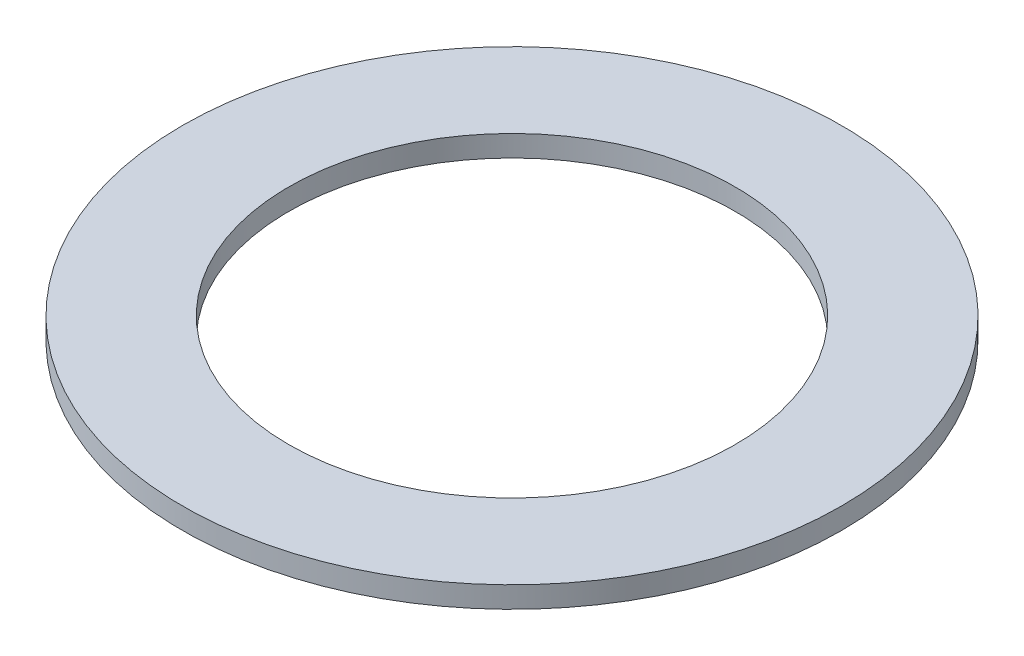
ISO-10303-21;
HEADER;
FILE_DESCRIPTION(('STEP AP214'),'2;1');
FILE_NAME('part.step','',(''),(''),'','','');
FILE_SCHEMA(('AUTOMOTIVE_DESIGN { 1 0 10303 214 1 1 1 1 }'));
ENDSEC;
DATA;
#1=APPLICATION_CONTEXT('core data for automotive mechanical design processes');
#2=APPLICATION_PROTOCOL_DEFINITION('international standard','automotive_design',2000,#1);
#3=PRODUCT_CONTEXT('',#1,'mechanical');
#4=PRODUCT('Part','Part','',(#3));
#5=PRODUCT_RELATED_PRODUCT_CATEGORY('part','',(#4));
#6=PRODUCT_DEFINITION_FORMATION('','',#4);
#7=PRODUCT_DEFINITION_CONTEXT('part definition',#1,'design');
#8=PRODUCT_DEFINITION('design','',#6,#7);
#9=PRODUCT_DEFINITION_SHAPE('','',#8);
#10=(LENGTH_UNIT() NAMED_UNIT(*) SI_UNIT(.MILLI.,.METRE.));
#11=(NAMED_UNIT(*) PLANE_ANGLE_UNIT() SI_UNIT($,.RADIAN.));
#12=(NAMED_UNIT(*) SI_UNIT($,.STERADIAN.) SOLID_ANGLE_UNIT());
#13=UNCERTAINTY_MEASURE_WITH_UNIT(LENGTH_MEASURE(1.E-05),#10,'distance_accuracy_value','');
#14=(GEOMETRIC_REPRESENTATION_CONTEXT(3) GLOBAL_UNCERTAINTY_ASSIGNED_CONTEXT((#13)) GLOBAL_UNIT_ASSIGNED_CONTEXT((#10,
#11,#12)) REPRESENTATION_CONTEXT('',''));
#15=CARTESIAN_POINT('',(0.,0.,0.));
#16=DIRECTION('',(0.,0.,1.));
#17=DIRECTION('',(1.,0.,0.));
#18=AXIS2_PLACEMENT_3D('',#15,#16,#17);
#19=CARTESIAN_POINT('',(0.,1.,0.));
#20=DIRECTION('',(0.,1.,0.));
#21=DIRECTION('',(0.,0.,1.));
#22=AXIS2_PLACEMENT_3D('',#19,#20,#21);
#23=PLANE('',#22);
#24=CARTESIAN_POINT('',(0.,1.,0.));
#25=DIRECTION('',(0.,1.,0.));
#26=DIRECTION('',(1.,0.,0.));
#27=AXIS2_PLACEMENT_3D('',#24,#25,#26);
#28=CIRCLE('',#27,15.5);
#29=CARTESIAN_POINT('',(15.5,1.,0.));
#30=VERTEX_POINT('',#29);
#31=EDGE_CURVE('E13',#30,#30,#28,.T.);
#32=ORIENTED_EDGE('',*,*,#31,.T.);
#33=EDGE_LOOP('',(#32));
#34=FACE_BOUND('',#33,.T.);
#35=CARTESIAN_POINT('',(0.,1.,0.));
#36=DIRECTION('',(0.,1.,0.));
#37=DIRECTION('',(0.,0.,1.));
#38=AXIS2_PLACEMENT_3D('',#35,#36,#37);
#39=CIRCLE('',#38,10.5);
#40=CARTESIAN_POINT('',(0.,1.,10.5));
#41=VERTEX_POINT('',#40);
#42=EDGE_CURVE('E61',#41,#41,#39,.T.);
#43=ORIENTED_EDGE('',*,*,#42,.F.);
#44=EDGE_LOOP('',(#43));
#45=FACE_BOUND('',#44,.T.);
#46=ADVANCED_FACE('F50',(#34,#45),#23,.T.);
#47=CARTESIAN_POINT('',(0.,0.,0.));
#48=DIRECTION('',(0.,1.,0.));
#49=DIRECTION('',(0.,0.,1.));
#50=AXIS2_PLACEMENT_3D('',#47,#48,#49);
#51=PLANE('',#50);
#52=CARTESIAN_POINT('',(0.,0.,0.));
#53=DIRECTION('',(0.,1.,0.));
#54=DIRECTION('',(1.,0.,0.));
#55=AXIS2_PLACEMENT_3D('',#52,#53,#54);
#56=CIRCLE('',#55,15.5);
#57=CARTESIAN_POINT('',(15.5,0.,0.));
#58=VERTEX_POINT('',#57);
#59=EDGE_CURVE('E54',#58,#58,#56,.T.);
#60=ORIENTED_EDGE('',*,*,#59,.F.);
#61=EDGE_LOOP('',(#60));
#62=FACE_BOUND('',#61,.T.);
#63=CARTESIAN_POINT('',(0.,0.,0.));
#64=DIRECTION('',(0.,1.,0.));
#65=DIRECTION('',(0.,0.,1.));
#66=AXIS2_PLACEMENT_3D('',#63,#64,#65);
#67=CIRCLE('',#66,10.5);
#68=CARTESIAN_POINT('',(0.,0.,10.5));
#69=VERTEX_POINT('',#68);
#70=EDGE_CURVE('E63',#69,#69,#67,.T.);
#71=ORIENTED_EDGE('',*,*,#70,.T.);
#72=EDGE_LOOP('',(#71));
#73=FACE_BOUND('',#72,.T.);
#74=ADVANCED_FACE('F73',(#62,#73),#51,.F.);
#75=CARTESIAN_POINT('',(0.,1.,0.));
#76=DIRECTION('',(0.,-1.,0.));
#77=DIRECTION('',(0.,0.,-1.));
#78=AXIS2_PLACEMENT_3D('',#75,#76,#77);
#79=CYLINDRICAL_SURFACE('',#78,15.5);
#80=ORIENTED_EDGE('',*,*,#31,.F.);
#81=EDGE_LOOP('',(#80));
#82=FACE_BOUND('',#81,.T.);
#83=ORIENTED_EDGE('',*,*,#59,.T.);
#84=EDGE_LOOP('',(#83));
#85=FACE_BOUND('',#84,.T.);
#86=ADVANCED_FACE('F52',(#82,#85),#79,.T.);
#87=CARTESIAN_POINT('',(0.,1.,0.));
#88=DIRECTION('',(0.,-1.,0.));
#89=DIRECTION('',(0.,0.,-1.));
#90=AXIS2_PLACEMENT_3D('',#87,#88,#89);
#91=CYLINDRICAL_SURFACE('',#90,10.5);
#92=ORIENTED_EDGE('',*,*,#42,.T.);
#93=EDGE_LOOP('',(#92));
#94=FACE_BOUND('',#93,.T.);
#95=ORIENTED_EDGE('',*,*,#70,.F.);
#96=EDGE_LOOP('',(#95));
#97=FACE_BOUND('',#96,.T.);
#98=ADVANCED_FACE('F69',(#94,#97),#91,.F.);
#99=CLOSED_SHELL('',(#46,#74,#86,#98));
#100=MANIFOLD_SOLID_BREP('B2',#99);
#101=ADVANCED_BREP_SHAPE_REPRESENTATION('',(#18,#100),#14);
#102=SHAPE_DEFINITION_REPRESENTATION(#9,#101);
ENDSEC;
END-ISO-10303-21;
